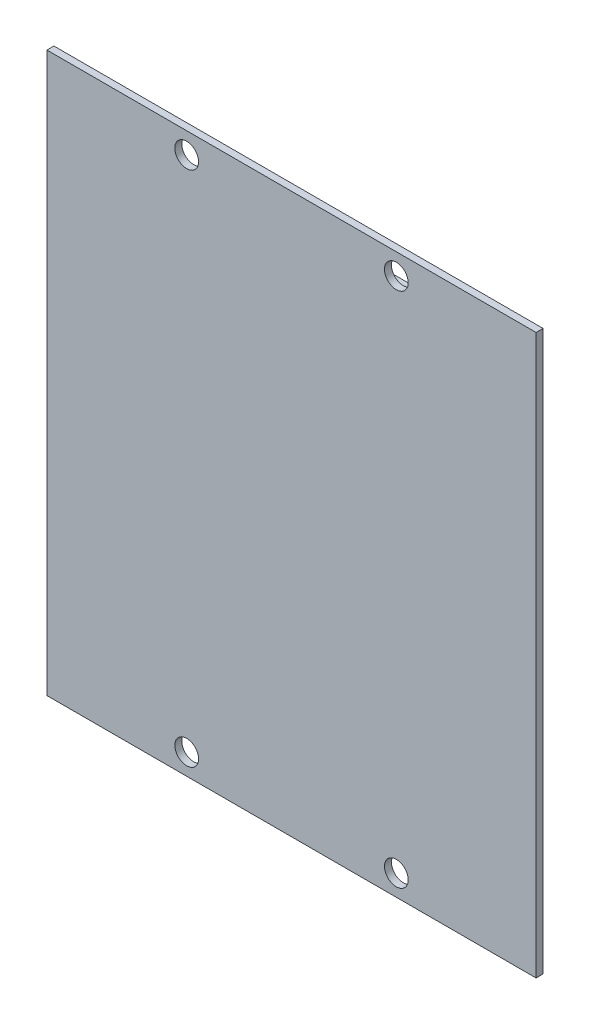
ISO-10303-21;
HEADER;
FILE_DESCRIPTION(('STEP AP214'),'2;1');
FILE_NAME('part.step','',(''),(''),'','','');
FILE_SCHEMA(('AUTOMOTIVE_DESIGN { 1 0 10303 214 1 1 1 1 }'));
ENDSEC;
DATA;
#1=APPLICATION_CONTEXT('core data for automotive mechanical design processes');
#2=APPLICATION_PROTOCOL_DEFINITION('international standard','automotive_design',2000,#1);
#3=PRODUCT_CONTEXT('',#1,'mechanical');
#4=PRODUCT('Part','Part','',(#3));
#5=PRODUCT_RELATED_PRODUCT_CATEGORY('part','',(#4));
#6=PRODUCT_DEFINITION_FORMATION('','',#4);
#7=PRODUCT_DEFINITION_CONTEXT('part definition',#1,'design');
#8=PRODUCT_DEFINITION('design','',#6,#7);
#9=PRODUCT_DEFINITION_SHAPE('','',#8);
#10=(LENGTH_UNIT() NAMED_UNIT(*) SI_UNIT(.MILLI.,.METRE.));
#11=(NAMED_UNIT(*) PLANE_ANGLE_UNIT() SI_UNIT($,.RADIAN.));
#12=(NAMED_UNIT(*) SI_UNIT($,.STERADIAN.) SOLID_ANGLE_UNIT());
#13=UNCERTAINTY_MEASURE_WITH_UNIT(LENGTH_MEASURE(1.E-05),#10,'distance_accuracy_value','');
#14=(GEOMETRIC_REPRESENTATION_CONTEXT(3) GLOBAL_UNCERTAINTY_ASSIGNED_CONTEXT((#13)) GLOBAL_UNIT_ASSIGNED_CONTEXT((#10,
#11,#12)) REPRESENTATION_CONTEXT('',''));
#15=CARTESIAN_POINT('',(0.,0.,0.));
#16=DIRECTION('',(0.,0.,1.));
#17=DIRECTION('',(1.,0.,0.));
#18=AXIS2_PLACEMENT_3D('',#15,#16,#17);
#19=CARTESIAN_POINT('',(0.,0.,0.));
#20=DIRECTION('',(0.,0.,-1.));
#21=DIRECTION('',(-1.,0.,0.));
#22=AXIS2_PLACEMENT_3D('',#19,#20,#21);
#23=PLANE('',#22);
#24=DIRECTION('',(0.,1.,0.));
#25=VECTOR('',#24,1.);
#26=CARTESIAN_POINT('',(35.,-40.,0.));
#27=LINE('',#26,#25);
#28=CARTESIAN_POINT('',(35.,-40.,0.));
#29=VERTEX_POINT('',#28);
#30=CARTESIAN_POINT('',(35.,40.,0.));
#31=VERTEX_POINT('',#30);
#32=EDGE_CURVE('E153',#29,#31,#27,.T.);
#33=ORIENTED_EDGE('',*,*,#32,.T.);
#34=DIRECTION('',(-1.,0.,0.));
#35=VECTOR('',#34,1.);
#36=CARTESIAN_POINT('',(-35.,40.,0.));
#37=LINE('',#36,#35);
#38=CARTESIAN_POINT('',(-35.,40.,0.));
#39=VERTEX_POINT('',#38);
#40=EDGE_CURVE('E168',#31,#39,#37,.T.);
#41=ORIENTED_EDGE('',*,*,#40,.T.);
#42=DIRECTION('',(0.,-1.,0.));
#43=VECTOR('',#42,1.);
#44=CARTESIAN_POINT('',(-35.,-40.,0.));
#45=LINE('',#44,#43);
#46=CARTESIAN_POINT('',(-35.,-40.,0.));
#47=VERTEX_POINT('',#46);
#48=EDGE_CURVE('E175',#39,#47,#45,.T.);
#49=ORIENTED_EDGE('',*,*,#48,.T.);
#50=DIRECTION('',(1.,0.,0.));
#51=VECTOR('',#50,1.);
#52=CARTESIAN_POINT('',(-35.,-40.,0.));
#53=LINE('',#52,#51);
#54=EDGE_CURVE('E158',#47,#29,#53,.T.);
#55=ORIENTED_EDGE('',*,*,#54,.T.);
#56=EDGE_LOOP('',(#33,#41,#49,#55));
#57=FACE_BOUND('',#56,.T.);
#58=CARTESIAN_POINT('',(-15.,-37.,1.2E-05));
#59=DIRECTION('',(0.,0.,1.));
#60=DIRECTION('',(1.,0.,0.));
#61=AXIS2_PLACEMENT_3D('',#58,#59,#60);
#62=CIRCLE('',#61,1.7);
#63=CARTESIAN_POINT('',(-13.3,-37.,1.2E-05));
#64=VERTEX_POINT('',#63);
#65=EDGE_CURVE('E187',#64,#64,#62,.T.);
#66=ORIENTED_EDGE('',*,*,#65,.F.);
#67=EDGE_LOOP('',(#66));
#68=FACE_BOUND('',#67,.T.);
#69=CARTESIAN_POINT('',(15.,37.,1.2E-05));
#70=DIRECTION('',(0.,0.,1.));
#71=DIRECTION('',(1.,0.,0.));
#72=AXIS2_PLACEMENT_3D('',#69,#70,#71);
#73=CIRCLE('',#72,1.7);
#74=CARTESIAN_POINT('',(16.7,37.,1.2E-05));
#75=VERTEX_POINT('',#74);
#76=EDGE_CURVE('E245',#75,#75,#73,.T.);
#77=ORIENTED_EDGE('',*,*,#76,.F.);
#78=EDGE_LOOP('',(#77));
#79=FACE_BOUND('',#78,.T.);
#80=CARTESIAN_POINT('',(15.,-37.,1.2E-05));
#81=DIRECTION('',(0.,0.,1.));
#82=DIRECTION('',(1.,0.,0.));
#83=AXIS2_PLACEMENT_3D('',#80,#81,#82);
#84=CIRCLE('',#83,1.7);
#85=CARTESIAN_POINT('',(16.7,-37.,1.2E-05));
#86=VERTEX_POINT('',#85);
#87=EDGE_CURVE('E226',#86,#86,#84,.T.);
#88=ORIENTED_EDGE('',*,*,#87,.F.);
#89=EDGE_LOOP('',(#88));
#90=FACE_BOUND('',#89,.T.);
#91=CARTESIAN_POINT('',(-15.,37.,1.2E-05));
#92=DIRECTION('',(0.,0.,1.));
#93=DIRECTION('',(1.,0.,0.));
#94=AXIS2_PLACEMENT_3D('',#91,#92,#93);
#95=CIRCLE('',#94,1.7);
#96=CARTESIAN_POINT('',(-13.3,37.,1.2E-05));
#97=VERTEX_POINT('',#96);
#98=EDGE_CURVE('E238',#97,#97,#95,.T.);
#99=ORIENTED_EDGE('',*,*,#98,.F.);
#100=EDGE_LOOP('',(#99));
#101=FACE_BOUND('',#100,.T.);
#102=ADVANCED_FACE('F39',(#57,#68,#79,#90,#101),#23,.F.);
#103=CARTESIAN_POINT('',(35.,-40.,-1.));
#104=DIRECTION('',(1.,0.,0.));
#105=DIRECTION('',(0.,0.,-1.));
#106=AXIS2_PLACEMENT_3D('',#103,#104,#105);
#107=PLANE('',#106);
#108=ORIENTED_EDGE('',*,*,#32,.F.);
#109=DIRECTION('',(0.,0.,1.));
#110=VECTOR('',#109,1.);
#111=CARTESIAN_POINT('',(35.,-40.,-1.));
#112=LINE('',#111,#110);
#113=CARTESIAN_POINT('',(35.,-40.,-1.));
#114=VERTEX_POINT('',#113);
#115=EDGE_CURVE('E11',#114,#29,#112,.T.);
#116=ORIENTED_EDGE('',*,*,#115,.F.);
#117=DIRECTION('',(0.,1.,0.));
#118=VECTOR('',#117,1.);
#119=CARTESIAN_POINT('',(35.,-40.,-1.));
#120=LINE('',#119,#118);
#121=CARTESIAN_POINT('',(35.,40.,-1.));
#122=VERTEX_POINT('',#121);
#123=EDGE_CURVE('E152',#114,#122,#120,.T.);
#124=ORIENTED_EDGE('',*,*,#123,.T.);
#125=DIRECTION('',(0.,0.,1.));
#126=VECTOR('',#125,1.);
#127=CARTESIAN_POINT('',(35.,40.,-1.));
#128=LINE('',#127,#126);
#129=EDGE_CURVE('E170',#122,#31,#128,.T.);
#130=ORIENTED_EDGE('',*,*,#129,.T.);
#131=EDGE_LOOP('',(#108,#116,#124,#130));
#132=FACE_BOUND('',#131,.T.);
#133=ADVANCED_FACE('F41',(#132),#107,.T.);
#134=CARTESIAN_POINT('',(-35.,-40.,-1.));
#135=DIRECTION('',(0.,-1.,0.));
#136=DIRECTION('',(0.,0.,-1.));
#137=AXIS2_PLACEMENT_3D('',#134,#135,#136);
#138=PLANE('',#137);
#139=ORIENTED_EDGE('',*,*,#54,.F.);
#140=DIRECTION('',(0.,0.,1.));
#141=VECTOR('',#140,1.);
#142=CARTESIAN_POINT('',(-35.,-40.,-1.));
#143=LINE('',#142,#141);
#144=CARTESIAN_POINT('',(-35.,-40.,-1.));
#145=VERTEX_POINT('',#144);
#146=EDGE_CURVE('E49',#145,#47,#143,.T.);
#147=ORIENTED_EDGE('',*,*,#146,.F.);
#148=DIRECTION('',(1.,0.,0.));
#149=VECTOR('',#148,1.);
#150=CARTESIAN_POINT('',(-35.,-40.,-1.));
#151=LINE('',#150,#149);
#152=EDGE_CURVE('E163',#145,#114,#151,.T.);
#153=ORIENTED_EDGE('',*,*,#152,.T.);
#154=ORIENTED_EDGE('',*,*,#115,.T.);
#155=EDGE_LOOP('',(#139,#147,#153,#154));
#156=FACE_BOUND('',#155,.T.);
#157=ADVANCED_FACE('F215',(#156),#138,.T.);
#158=CARTESIAN_POINT('',(-35.,-40.,-1.));
#159=DIRECTION('',(-1.,0.,0.));
#160=DIRECTION('',(0.,0.,1.));
#161=AXIS2_PLACEMENT_3D('',#158,#159,#160);
#162=PLANE('',#161);
#163=ORIENTED_EDGE('',*,*,#48,.F.);
#164=DIRECTION('',(0.,0.,1.));
#165=VECTOR('',#164,1.);
#166=CARTESIAN_POINT('',(-35.,40.,-1.));
#167=LINE('',#166,#165);
#168=CARTESIAN_POINT('',(-35.,40.,-1.));
#169=VERTEX_POINT('',#168);
#170=EDGE_CURVE('E176',#169,#39,#167,.T.);
#171=ORIENTED_EDGE('',*,*,#170,.F.);
#172=DIRECTION('',(0.,-1.,0.));
#173=VECTOR('',#172,1.);
#174=CARTESIAN_POINT('',(-35.,-40.,-1.));
#175=LINE('',#174,#173);
#176=EDGE_CURVE('E161',#169,#145,#175,.T.);
#177=ORIENTED_EDGE('',*,*,#176,.T.);
#178=ORIENTED_EDGE('',*,*,#146,.T.);
#179=EDGE_LOOP('',(#163,#171,#177,#178));
#180=FACE_BOUND('',#179,.T.);
#181=ADVANCED_FACE('F310',(#180),#162,.T.);
#182=CARTESIAN_POINT('',(-35.,40.,-1.));
#183=DIRECTION('',(0.,1.,0.));
#184=DIRECTION('',(0.,0.,1.));
#185=AXIS2_PLACEMENT_3D('',#182,#183,#184);
#186=PLANE('',#185);
#187=ORIENTED_EDGE('',*,*,#40,.F.);
#188=ORIENTED_EDGE('',*,*,#129,.F.);
#189=DIRECTION('',(-1.,0.,0.));
#190=VECTOR('',#189,1.);
#191=CARTESIAN_POINT('',(-35.,40.,-1.));
#192=LINE('',#191,#190);
#193=EDGE_CURVE('E160',#122,#169,#192,.T.);
#194=ORIENTED_EDGE('',*,*,#193,.T.);
#195=ORIENTED_EDGE('',*,*,#170,.T.);
#196=EDGE_LOOP('',(#187,#188,#194,#195));
#197=FACE_BOUND('',#196,.T.);
#198=ADVANCED_FACE('F303',(#197),#186,.T.);
#199=CARTESIAN_POINT('',(0.,0.,-1.));
#200=DIRECTION('',(0.,0.,-1.));
#201=DIRECTION('',(-1.,0.,0.));
#202=AXIS2_PLACEMENT_3D('',#199,#200,#201);
#203=PLANE('',#202);
#204=CARTESIAN_POINT('',(-15.,37.,-1.));
#205=DIRECTION('',(0.,0.,-1.));
#206=DIRECTION('',(-1.,0.,0.));
#207=AXIS2_PLACEMENT_3D('',#204,#205,#206);
#208=CIRCLE('',#207,1.7);
#209=CARTESIAN_POINT('',(-16.7,37.,-1.));
#210=VERTEX_POINT('',#209);
#211=EDGE_CURVE('E128',#210,#210,#208,.F.);
#212=ORIENTED_EDGE('',*,*,#211,.T.);
#213=EDGE_LOOP('',(#212));
#214=FACE_BOUND('',#213,.T.);
#215=CARTESIAN_POINT('',(15.,-37.,-1.));
#216=DIRECTION('',(0.,0.,-1.));
#217=DIRECTION('',(-1.,0.,0.));
#218=AXIS2_PLACEMENT_3D('',#215,#216,#217);
#219=CIRCLE('',#218,1.7);
#220=CARTESIAN_POINT('',(13.3,-37.,-1.));
#221=VERTEX_POINT('',#220);
#222=EDGE_CURVE('E135',#221,#221,#219,.F.);
#223=ORIENTED_EDGE('',*,*,#222,.T.);
#224=EDGE_LOOP('',(#223));
#225=FACE_BOUND('',#224,.T.);
#226=CARTESIAN_POINT('',(15.,37.,-1.));
#227=DIRECTION('',(0.,0.,-1.));
#228=DIRECTION('',(-1.,0.,0.));
#229=AXIS2_PLACEMENT_3D('',#226,#227,#228);
#230=CIRCLE('',#229,1.7);
#231=CARTESIAN_POINT('',(13.3,37.,-1.));
#232=VERTEX_POINT('',#231);
#233=EDGE_CURVE('E183',#232,#232,#230,.F.);
#234=ORIENTED_EDGE('',*,*,#233,.T.);
#235=EDGE_LOOP('',(#234));
#236=FACE_BOUND('',#235,.T.);
#237=CARTESIAN_POINT('',(-15.,-37.,-1.));
#238=DIRECTION('',(0.,0.,-1.));
#239=DIRECTION('',(-1.,0.,0.));
#240=AXIS2_PLACEMENT_3D('',#237,#238,#239);
#241=CIRCLE('',#240,1.7);
#242=CARTESIAN_POINT('',(-16.7,-37.,-1.));
#243=VERTEX_POINT('',#242);
#244=EDGE_CURVE('E185',#243,#243,#241,.F.);
#245=ORIENTED_EDGE('',*,*,#244,.T.);
#246=EDGE_LOOP('',(#245));
#247=FACE_BOUND('',#246,.T.);
#248=DIRECTION('',(0.,-1.,0.));
#249=VECTOR('',#248,1.);
#250=CARTESIAN_POINT('',(22.75,0.,-1.));
#251=LINE('',#250,#249);
#252=CARTESIAN_POINT('',(22.75,24.,-1.));
#253=VERTEX_POINT('',#252);
#254=CARTESIAN_POINT('',(22.75,-24.,-1.));
#255=VERTEX_POINT('',#254);
#256=EDGE_CURVE('E151',#253,#255,#251,.T.);
#257=ORIENTED_EDGE('',*,*,#256,.F.);
#258=DIRECTION('',(1.,0.,0.));
#259=VECTOR('',#258,1.);
#260=CARTESIAN_POINT('',(0.,24.,-1.));
#261=LINE('',#260,#259);
#262=CARTESIAN_POINT('',(-22.75,24.,-1.));
#263=VERTEX_POINT('',#262);
#264=EDGE_CURVE('E112',#263,#253,#261,.T.);
#265=ORIENTED_EDGE('',*,*,#264,.F.);
#266=DIRECTION('',(0.,1.,0.));
#267=VECTOR('',#266,1.);
#268=CARTESIAN_POINT('',(-22.75,0.,-1.));
#269=LINE('',#268,#267);
#270=CARTESIAN_POINT('',(-22.75,-24.,-1.));
#271=VERTEX_POINT('',#270);
#272=EDGE_CURVE('E65',#271,#263,#269,.T.);
#273=ORIENTED_EDGE('',*,*,#272,.F.);
#274=DIRECTION('',(-1.,0.,0.));
#275=VECTOR('',#274,1.);
#276=CARTESIAN_POINT('',(0.,-24.,-1.));
#277=LINE('',#276,#275);
#278=EDGE_CURVE('E59',#255,#271,#277,.T.);
#279=ORIENTED_EDGE('',*,*,#278,.F.);
#280=EDGE_LOOP('',(#257,#265,#273,#279));
#281=FACE_BOUND('',#280,.T.);
#282=ORIENTED_EDGE('',*,*,#123,.F.);
#283=ORIENTED_EDGE('',*,*,#152,.F.);
#284=ORIENTED_EDGE('',*,*,#176,.F.);
#285=ORIENTED_EDGE('',*,*,#193,.F.);
#286=EDGE_LOOP('',(#282,#283,#284,#285));
#287=FACE_BOUND('',#286,.T.);
#288=ADVANCED_FACE('F209',(#214,#225,#236,#247,#281,#287),#203,.T.);
#289=CARTESIAN_POINT('',(22.75,-24.,-13.));
#290=DIRECTION('',(1.,0.,0.));
#291=DIRECTION('',(0.,0.,-1.));
#292=AXIS2_PLACEMENT_3D('',#289,#290,#291);
#293=PLANE('',#292);
#294=DIRECTION('',(0.,0.,1.));
#295=VECTOR('',#294,1.);
#296=CARTESIAN_POINT('',(22.75,24.,-13.));
#297=LINE('',#296,#295);
#298=CARTESIAN_POINT('',(22.75,24.,-13.));
#299=VERTEX_POINT('',#298);
#300=EDGE_CURVE('E106',#299,#253,#297,.T.);
#301=ORIENTED_EDGE('',*,*,#300,.T.);
#302=ORIENTED_EDGE('',*,*,#256,.T.);
#303=DIRECTION('',(0.,0.,1.));
#304=VECTOR('',#303,1.);
#305=CARTESIAN_POINT('',(22.75,-24.,-13.));
#306=LINE('',#305,#304);
#307=CARTESIAN_POINT('',(22.75,-24.,-13.));
#308=VERTEX_POINT('',#307);
#309=EDGE_CURVE('E129',#308,#255,#306,.T.);
#310=ORIENTED_EDGE('',*,*,#309,.F.);
#311=DIRECTION('',(0.,1.,0.));
#312=VECTOR('',#311,1.);
#313=CARTESIAN_POINT('',(22.75,-24.,-13.));
#314=LINE('',#313,#312);
#315=EDGE_CURVE('E124',#308,#299,#314,.T.);
#316=ORIENTED_EDGE('',*,*,#315,.T.);
#317=EDGE_LOOP('',(#301,#302,#310,#316));
#318=FACE_BOUND('',#317,.T.);
#319=ADVANCED_FACE('F130',(#318),#293,.T.);
#320=CARTESIAN_POINT('',(-22.75,-24.,-13.));
#321=DIRECTION('',(0.,-1.,0.));
#322=DIRECTION('',(0.,0.,-1.));
#323=AXIS2_PLACEMENT_3D('',#320,#321,#322);
#324=PLANE('',#323);
#325=ORIENTED_EDGE('',*,*,#309,.T.);
#326=ORIENTED_EDGE('',*,*,#278,.T.);
#327=DIRECTION('',(0.,0.,1.));
#328=VECTOR('',#327,1.);
#329=CARTESIAN_POINT('',(-22.75,-24.,-13.));
#330=LINE('',#329,#328);
#331=CARTESIAN_POINT('',(-22.75,-24.,-13.));
#332=VERTEX_POINT('',#331);
#333=EDGE_CURVE('E145',#332,#271,#330,.T.);
#334=ORIENTED_EDGE('',*,*,#333,.F.);
#335=DIRECTION('',(1.,0.,0.));
#336=VECTOR('',#335,1.);
#337=CARTESIAN_POINT('',(-22.75,-24.,-13.));
#338=LINE('',#337,#336);
#339=EDGE_CURVE('E113',#332,#308,#338,.T.);
#340=ORIENTED_EDGE('',*,*,#339,.T.);
#341=EDGE_LOOP('',(#325,#326,#334,#340));
#342=FACE_BOUND('',#341,.T.);
#343=ADVANCED_FACE('F292',(#342),#324,.T.);
#344=CARTESIAN_POINT('',(-22.75,-24.,-13.));
#345=DIRECTION('',(-1.,0.,0.));
#346=DIRECTION('',(0.,0.,1.));
#347=AXIS2_PLACEMENT_3D('',#344,#345,#346);
#348=PLANE('',#347);
#349=ORIENTED_EDGE('',*,*,#333,.T.);
#350=ORIENTED_EDGE('',*,*,#272,.T.);
#351=DIRECTION('',(0.,0.,1.));
#352=VECTOR('',#351,1.);
#353=CARTESIAN_POINT('',(-22.75,24.,-13.));
#354=LINE('',#353,#352);
#355=CARTESIAN_POINT('',(-22.75,24.,-13.));
#356=VERTEX_POINT('',#355);
#357=EDGE_CURVE('E111',#356,#263,#354,.T.);
#358=ORIENTED_EDGE('',*,*,#357,.F.);
#359=DIRECTION('',(0.,-1.,0.));
#360=VECTOR('',#359,1.);
#361=CARTESIAN_POINT('',(-22.75,-24.,-13.));
#362=LINE('',#361,#360);
#363=EDGE_CURVE('E123',#356,#332,#362,.T.);
#364=ORIENTED_EDGE('',*,*,#363,.T.);
#365=EDGE_LOOP('',(#349,#350,#358,#364));
#366=FACE_BOUND('',#365,.T.);
#367=ADVANCED_FACE('F294',(#366),#348,.T.);
#368=CARTESIAN_POINT('',(-22.75,24.,-13.));
#369=DIRECTION('',(0.,1.,0.));
#370=DIRECTION('',(0.,0.,1.));
#371=AXIS2_PLACEMENT_3D('',#368,#369,#370);
#372=PLANE('',#371);
#373=ORIENTED_EDGE('',*,*,#357,.T.);
#374=ORIENTED_EDGE('',*,*,#264,.T.);
#375=ORIENTED_EDGE('',*,*,#300,.F.);
#376=DIRECTION('',(-1.,0.,0.));
#377=VECTOR('',#376,1.);
#378=CARTESIAN_POINT('',(-22.75,24.,-13.));
#379=LINE('',#378,#377);
#380=EDGE_CURVE('E109',#299,#356,#379,.T.);
#381=ORIENTED_EDGE('',*,*,#380,.T.);
#382=EDGE_LOOP('',(#373,#374,#375,#381));
#383=FACE_BOUND('',#382,.T.);
#384=ADVANCED_FACE('F108',(#383),#372,.T.);
#385=CARTESIAN_POINT('',(0.,0.,-13.));
#386=DIRECTION('',(0.,0.,-1.));
#387=DIRECTION('',(-1.,0.,0.));
#388=AXIS2_PLACEMENT_3D('',#385,#386,#387);
#389=PLANE('',#388);
#390=ORIENTED_EDGE('',*,*,#315,.F.);
#391=ORIENTED_EDGE('',*,*,#339,.F.);
#392=ORIENTED_EDGE('',*,*,#363,.F.);
#393=ORIENTED_EDGE('',*,*,#380,.F.);
#394=EDGE_LOOP('',(#390,#391,#392,#393));
#395=FACE_BOUND('',#394,.T.);
#396=ADVANCED_FACE('F118',(#395),#389,.T.);
#397=CARTESIAN_POINT('',(-15.,-37.,1.2E-05));
#398=DIRECTION('',(0.,0.,-1.));
#399=DIRECTION('',(-1.,0.,0.));
#400=AXIS2_PLACEMENT_3D('',#397,#398,#399);
#401=CYLINDRICAL_SURFACE('',#400,1.7);
#402=ORIENTED_EDGE('',*,*,#244,.F.);
#403=EDGE_LOOP('',(#402));
#404=FACE_BOUND('',#403,.T.);
#405=ORIENTED_EDGE('',*,*,#65,.T.);
#406=EDGE_LOOP('',(#405));
#407=FACE_BOUND('',#406,.T.);
#408=ADVANCED_FACE('F268',(#404,#407),#401,.F.);
#409=CARTESIAN_POINT('',(15.,37.,1.2E-05));
#410=DIRECTION('',(0.,0.,-1.));
#411=DIRECTION('',(-1.,0.,0.));
#412=AXIS2_PLACEMENT_3D('',#409,#410,#411);
#413=CYLINDRICAL_SURFACE('',#412,1.7);
#414=ORIENTED_EDGE('',*,*,#233,.F.);
#415=EDGE_LOOP('',(#414));
#416=FACE_BOUND('',#415,.T.);
#417=ORIENTED_EDGE('',*,*,#76,.T.);
#418=EDGE_LOOP('',(#417));
#419=FACE_BOUND('',#418,.T.);
#420=ADVANCED_FACE('F246',(#416,#419),#413,.F.);
#421=CARTESIAN_POINT('',(15.,-37.,1.2E-05));
#422=DIRECTION('',(0.,0.,-1.));
#423=DIRECTION('',(-1.,0.,0.));
#424=AXIS2_PLACEMENT_3D('',#421,#422,#423);
#425=CYLINDRICAL_SURFACE('',#424,1.7);
#426=ORIENTED_EDGE('',*,*,#222,.F.);
#427=EDGE_LOOP('',(#426));
#428=FACE_BOUND('',#427,.T.);
#429=ORIENTED_EDGE('',*,*,#87,.T.);
#430=EDGE_LOOP('',(#429));
#431=FACE_BOUND('',#430,.T.);
#432=ADVANCED_FACE('F270',(#428,#431),#425,.F.);
#433=CARTESIAN_POINT('',(-15.,37.,1.2E-05));
#434=DIRECTION('',(0.,0.,-1.));
#435=DIRECTION('',(-1.,0.,0.));
#436=AXIS2_PLACEMENT_3D('',#433,#434,#435);
#437=CYLINDRICAL_SURFACE('',#436,1.7);
#438=ORIENTED_EDGE('',*,*,#211,.F.);
#439=EDGE_LOOP('',(#438));
#440=FACE_BOUND('',#439,.T.);
#441=ORIENTED_EDGE('',*,*,#98,.T.);
#442=EDGE_LOOP('',(#441));
#443=FACE_BOUND('',#442,.T.);
#444=ADVANCED_FACE('F269',(#440,#443),#437,.F.);
#445=CLOSED_SHELL('',(#102,#133,#157,#181,#198,#288,#319,#343,#367,#384,#396,#408,#420,#432,#444));
#446=MANIFOLD_SOLID_BREP('B2',#445);
#447=ADVANCED_BREP_SHAPE_REPRESENTATION('',(#18,#446),#14);
#448=SHAPE_DEFINITION_REPRESENTATION(#9,#447);
ENDSEC;
END-ISO-10303-21;
